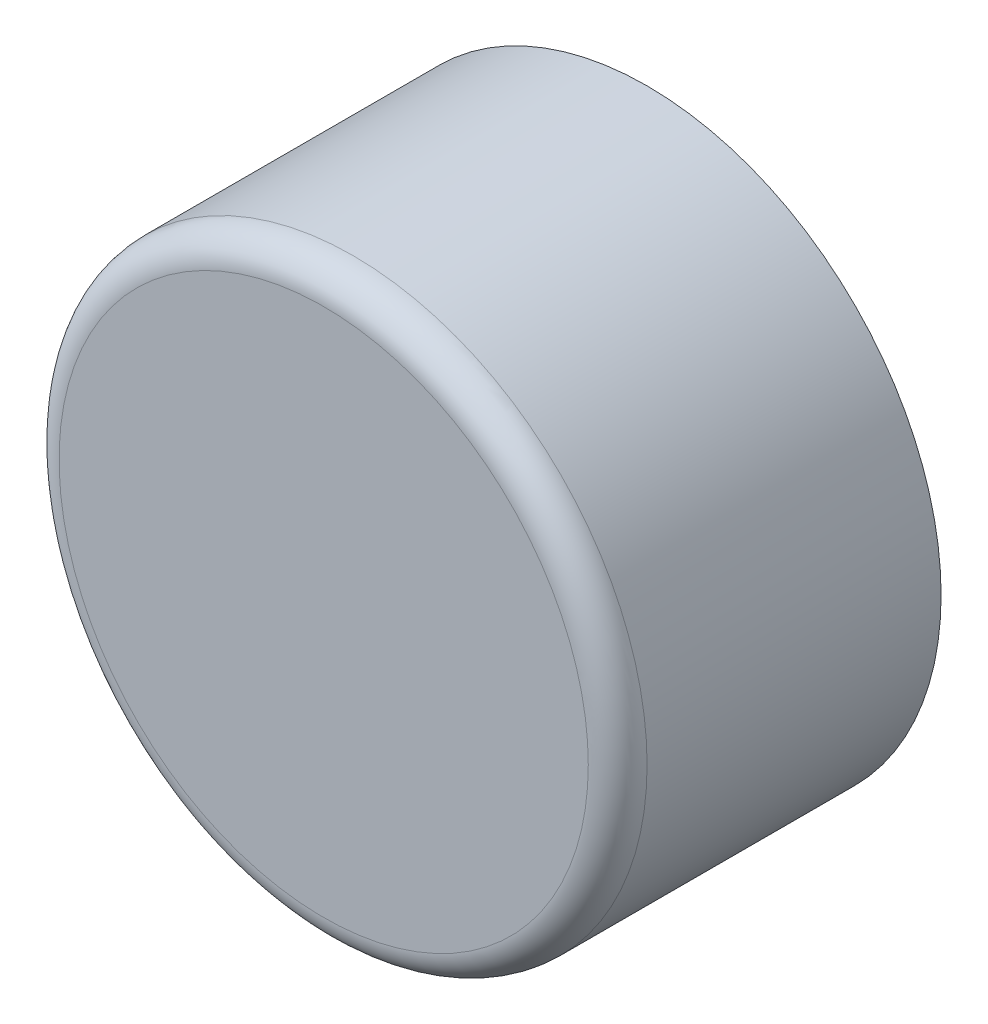
ISO-10303-21;
HEADER;
FILE_DESCRIPTION(('STEP AP214'),'2;1');
FILE_NAME('part.step','',(''),(''),'','','');
FILE_SCHEMA(('AUTOMOTIVE_DESIGN { 1 0 10303 214 1 1 1 1 }'));
ENDSEC;
DATA;
#1=APPLICATION_CONTEXT('core data for automotive mechanical design processes');
#2=APPLICATION_PROTOCOL_DEFINITION('international standard','automotive_design',2000,#1);
#3=PRODUCT_CONTEXT('',#1,'mechanical');
#4=PRODUCT('Part','Part','',(#3));
#5=PRODUCT_RELATED_PRODUCT_CATEGORY('part','',(#4));
#6=PRODUCT_DEFINITION_FORMATION('','',#4);
#7=PRODUCT_DEFINITION_CONTEXT('part definition',#1,'design');
#8=PRODUCT_DEFINITION('design','',#6,#7);
#9=PRODUCT_DEFINITION_SHAPE('','',#8);
#10=(LENGTH_UNIT() NAMED_UNIT(*) SI_UNIT(.MILLI.,.METRE.));
#11=(NAMED_UNIT(*) PLANE_ANGLE_UNIT() SI_UNIT($,.RADIAN.));
#12=(NAMED_UNIT(*) SI_UNIT($,.STERADIAN.) SOLID_ANGLE_UNIT());
#13=UNCERTAINTY_MEASURE_WITH_UNIT(LENGTH_MEASURE(1.E-05),#10,'distance_accuracy_value','');
#14=(GEOMETRIC_REPRESENTATION_CONTEXT(3) GLOBAL_UNCERTAINTY_ASSIGNED_CONTEXT((#13)) GLOBAL_UNIT_ASSIGNED_CONTEXT((#10,
#11,#12)) REPRESENTATION_CONTEXT('',''));
#15=CARTESIAN_POINT('',(0.,0.,0.));
#16=DIRECTION('',(0.,0.,1.));
#17=DIRECTION('',(1.,0.,0.));
#18=AXIS2_PLACEMENT_3D('',#15,#16,#17);
#19=CARTESIAN_POINT('',(0.,0.,0.));
#20=DIRECTION('',(0.,0.,1.));
#21=DIRECTION('',(1.,0.,0.));
#22=AXIS2_PLACEMENT_3D('',#19,#20,#21);
#23=PLANE('',#22);
#24=CARTESIAN_POINT('',(0.,0.,0.));
#25=DIRECTION('',(0.,0.,1.));
#26=DIRECTION('',(1.,0.,0.));
#27=AXIS2_PLACEMENT_3D('',#24,#25,#26);
#28=CIRCLE('',#27,20.);
#29=CARTESIAN_POINT('',(20.,0.,0.));
#30=VERTEX_POINT('',#29);
#31=EDGE_CURVE('E41',#30,#30,#28,.T.);
#32=ORIENTED_EDGE('',*,*,#31,.F.);
#33=EDGE_LOOP('',(#32));
#34=FACE_BOUND('',#33,.T.);
#35=CARTESIAN_POINT('',(0.,0.,0.));
#36=DIRECTION('',(0.,0.,1.));
#37=DIRECTION('',(1.,0.,0.));
#38=AXIS2_PLACEMENT_3D('',#35,#36,#37);
#39=CIRCLE('',#38,17.);
#40=CARTESIAN_POINT('',(17.,0.,0.));
#41=VERTEX_POINT('',#40);
#42=EDGE_CURVE('E45',#41,#41,#39,.T.);
#43=ORIENTED_EDGE('',*,*,#42,.T.);
#44=EDGE_LOOP('',(#43));
#45=FACE_BOUND('',#44,.T.);
#46=ADVANCED_FACE('F30',(#34,#45),#23,.F.);
#47=CARTESIAN_POINT('',(0.,0.,20.));
#48=DIRECTION('',(0.,0.,-1.));
#49=DIRECTION('',(-1.,0.,0.));
#50=AXIS2_PLACEMENT_3D('',#47,#48,#49);
#51=CYLINDRICAL_SURFACE('',#50,20.);
#52=CARTESIAN_POINT('',(0.,0.,20.));
#53=DIRECTION('',(0.,0.,1.));
#54=DIRECTION('',(1.,0.,0.));
#55=AXIS2_PLACEMENT_3D('',#52,#53,#54);
#56=CIRCLE('',#55,20.);
#57=CARTESIAN_POINT('',(20.,0.,20.));
#58=VERTEX_POINT('',#57);
#59=EDGE_CURVE('E10',#58,#58,#56,.F.);
#60=ORIENTED_EDGE('',*,*,#59,.T.);
#61=EDGE_LOOP('',(#60));
#62=FACE_BOUND('',#61,.T.);
#63=ORIENTED_EDGE('',*,*,#31,.T.);
#64=EDGE_LOOP('',(#63));
#65=FACE_BOUND('',#64,.T.);
#66=ADVANCED_FACE('F66',(#62,#65),#51,.T.);
#67=CARTESIAN_POINT('',(0.,0.,20.));
#68=DIRECTION('',(0.,0.,-1.));
#69=DIRECTION('',(-1.,0.,0.));
#70=AXIS2_PLACEMENT_3D('',#67,#68,#69);
#71=CYLINDRICAL_SURFACE('',#70,17.);
#72=CARTESIAN_POINT('',(0.,0.,20.));
#73=DIRECTION('',(0.,0.,1.));
#74=DIRECTION('',(1.,0.,0.));
#75=AXIS2_PLACEMENT_3D('',#72,#73,#74);
#76=CIRCLE('',#75,17.);
#77=CARTESIAN_POINT('',(17.,0.,20.));
#78=VERTEX_POINT('',#77);
#79=EDGE_CURVE('E50',#78,#78,#76,.T.);
#80=ORIENTED_EDGE('',*,*,#79,.T.);
#81=EDGE_LOOP('',(#80));
#82=FACE_BOUND('',#81,.T.);
#83=ORIENTED_EDGE('',*,*,#42,.F.);
#84=EDGE_LOOP('',(#83));
#85=FACE_BOUND('',#84,.T.);
#86=ADVANCED_FACE('F54',(#82,#85),#71,.F.);
#87=CARTESIAN_POINT('',(0.,0.,20.));
#88=DIRECTION('',(0.,0.,1.));
#89=DIRECTION('',(1.,0.,0.));
#90=AXIS2_PLACEMENT_3D('',#87,#88,#89);
#91=PLANE('',#90);
#92=ORIENTED_EDGE('',*,*,#79,.F.);
#93=EDGE_LOOP('',(#92));
#94=FACE_BOUND('',#93,.T.);
#95=ADVANCED_FACE('F57',(#94),#91,.F.);
#96=CARTESIAN_POINT('',(0.,0.,22.));
#97=DIRECTION('',(0.,0.,1.));
#98=DIRECTION('',(1.,0.,0.));
#99=AXIS2_PLACEMENT_3D('',#96,#97,#98);
#100=PLANE('',#99);
#101=CARTESIAN_POINT('',(0.,0.,22.));
#102=DIRECTION('',(0.,0.,1.));
#103=DIRECTION('',(1.,0.,0.));
#104=AXIS2_PLACEMENT_3D('',#101,#102,#103);
#105=CIRCLE('',#104,18.);
#106=CARTESIAN_POINT('',(18.,0.,22.));
#107=VERTEX_POINT('',#106);
#108=EDGE_CURVE('E37',#107,#107,#105,.T.);
#109=ORIENTED_EDGE('',*,*,#108,.T.);
#110=EDGE_LOOP('',(#109));
#111=FACE_BOUND('',#110,.T.);
#112=ADVANCED_FACE('F59',(#111),#100,.T.);
#113=CARTESIAN_POINT('',(0.,0.,20.));
#114=DIRECTION('',(0.,0.,1.));
#115=DIRECTION('',(1.,0.,0.));
#116=AXIS2_PLACEMENT_3D('',#113,#114,#115);
#117=TOROIDAL_SURFACE('',#116,18.,2.);
#118=ORIENTED_EDGE('',*,*,#59,.F.);
#119=EDGE_LOOP('',(#118));
#120=FACE_BOUND('',#119,.T.);
#121=ORIENTED_EDGE('',*,*,#108,.F.);
#122=EDGE_LOOP('',(#121));
#123=FACE_BOUND('',#122,.T.);
#124=ADVANCED_FACE('F32',(#120,#123),#117,.T.);
#125=CLOSED_SHELL('',(#46,#66,#86,#95,#112,#124));
#126=MANIFOLD_SOLID_BREP('B2',#125);
#127=ADVANCED_BREP_SHAPE_REPRESENTATION('',(#18,#126),#14);
#128=SHAPE_DEFINITION_REPRESENTATION(#9,#127);
ENDSEC;
END-ISO-10303-21;
